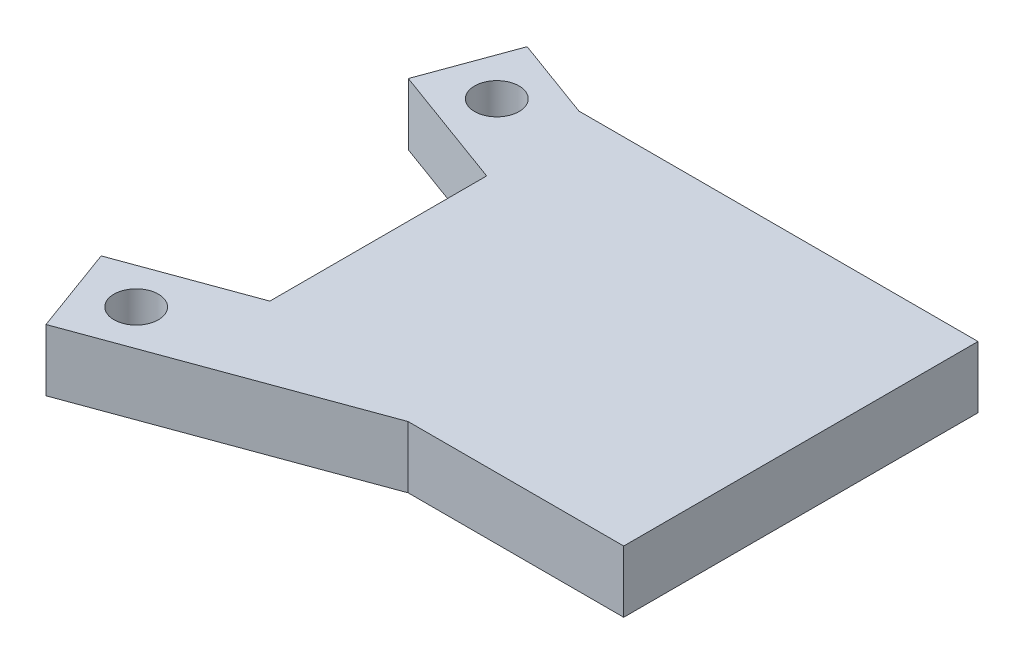
ISO-10303-21;
HEADER;
FILE_DESCRIPTION(('STEP AP214'),'2;1');
FILE_NAME('part.step','',(''),(''),'','','');
FILE_SCHEMA(('AUTOMOTIVE_DESIGN { 1 0 10303 214 1 1 1 1 }'));
ENDSEC;
DATA;
#1=APPLICATION_CONTEXT('core data for automotive mechanical design processes');
#2=APPLICATION_PROTOCOL_DEFINITION('international standard','automotive_design',2000,#1);
#3=PRODUCT_CONTEXT('',#1,'mechanical');
#4=PRODUCT('Part','Part','',(#3));
#5=PRODUCT_RELATED_PRODUCT_CATEGORY('part','',(#4));
#6=PRODUCT_DEFINITION_FORMATION('','',#4);
#7=PRODUCT_DEFINITION_CONTEXT('part definition',#1,'design');
#8=PRODUCT_DEFINITION('design','',#6,#7);
#9=PRODUCT_DEFINITION_SHAPE('','',#8);
#10=(LENGTH_UNIT() NAMED_UNIT(*) SI_UNIT(.MILLI.,.METRE.));
#11=(NAMED_UNIT(*) PLANE_ANGLE_UNIT() SI_UNIT($,.RADIAN.));
#12=(NAMED_UNIT(*) SI_UNIT($,.STERADIAN.) SOLID_ANGLE_UNIT());
#13=UNCERTAINTY_MEASURE_WITH_UNIT(LENGTH_MEASURE(1.E-05),#10,'distance_accuracy_value','');
#14=(GEOMETRIC_REPRESENTATION_CONTEXT(3) GLOBAL_UNCERTAINTY_ASSIGNED_CONTEXT((#13)) GLOBAL_UNIT_ASSIGNED_CONTEXT((#10,
#11,#12)) REPRESENTATION_CONTEXT('',''));
#15=CARTESIAN_POINT('',(0.,0.,0.));
#16=DIRECTION('',(0.,0.,1.));
#17=DIRECTION('',(1.,0.,0.));
#18=AXIS2_PLACEMENT_3D('',#15,#16,#17);
#19=CARTESIAN_POINT('',(17.9561225197457,6.35,30.7695046606628));
#20=DIRECTION('',(0.939099535747027,0.,0.34364525598314));
#21=DIRECTION('',(0.34364525598314,0.,-0.939099535747028));
#22=AXIS2_PLACEMENT_3D('',#19,#20,#21);
#23=PLANE('',#22);
#24=DIRECTION('',(-0.34364525598314,0.,0.939099535747027));
#25=VECTOR('',#24,1.);
#26=CARTESIAN_POINT('',(17.9561225197457,0.,30.7695046606628));
#27=LINE('',#26,#25);
#28=CARTESIAN_POINT('',(21.2293435829851,0.,21.8245815826724));
#29=VERTEX_POINT('',#28);
#30=CARTESIAN_POINT('',(17.9561225197457,0.,30.7695046606628));
#31=VERTEX_POINT('',#30);
#32=EDGE_CURVE('E147',#29,#31,#27,.T.);
#33=ORIENTED_EDGE('',*,*,#32,.T.);
#34=DIRECTION('',(0.,-1.,0.));
#35=VECTOR('',#34,1.);
#36=CARTESIAN_POINT('',(17.9561225197457,6.35,30.7695046606628));
#37=LINE('',#36,#35);
#38=CARTESIAN_POINT('',(17.9561225197457,6.35,30.7695046606628));
#39=VERTEX_POINT('',#38);
#40=EDGE_CURVE('E11',#39,#31,#37,.T.);
#41=ORIENTED_EDGE('',*,*,#40,.F.);
#42=DIRECTION('',(-0.34364525598314,0.,0.939099535747027));
#43=VECTOR('',#42,1.);
#44=CARTESIAN_POINT('',(17.9561225197457,6.35,30.7695046606628));
#45=LINE('',#44,#43);
#46=CARTESIAN_POINT('',(21.2293435829851,6.35,21.8245815826724));
#47=VERTEX_POINT('',#46);
#48=EDGE_CURVE('E166',#47,#39,#45,.T.);
#49=ORIENTED_EDGE('',*,*,#48,.F.);
#50=DIRECTION('',(0.,-1.,0.));
#51=VECTOR('',#50,1.);
#52=CARTESIAN_POINT('',(21.2293435829851,6.35,21.8245815826724));
#53=LINE('',#52,#51);
#54=EDGE_CURVE('E143',#47,#29,#53,.T.);
#55=ORIENTED_EDGE('',*,*,#54,.T.);
#56=EDGE_LOOP('',(#33,#41,#49,#55));
#57=FACE_BOUND('',#56,.T.);
#58=ADVANCED_FACE('F39',(#57),#23,.F.);
#59=CARTESIAN_POINT('',(30.6561225197457,6.35,35.4168232726502));
#60=DIRECTION('',(0.343645255983139,0.,-0.939099535747028));
#61=DIRECTION('',(-0.939099535747028,0.,-0.343645255983139));
#62=AXIS2_PLACEMENT_3D('',#59,#60,#61);
#63=PLANE('',#62);
#64=DIRECTION('',(0.939099535747028,0.,0.343645255983139));
#65=VECTOR('',#64,1.);
#66=CARTESIAN_POINT('',(30.6561225197457,0.,35.4168232726502));
#67=LINE('',#66,#65);
#68=CARTESIAN_POINT('',(30.6561225197457,0.,35.4168232726502));
#69=VERTEX_POINT('',#68);
#70=EDGE_CURVE('E150',#31,#69,#67,.T.);
#71=ORIENTED_EDGE('',*,*,#70,.T.);
#72=DIRECTION('',(0.,-1.,0.));
#73=VECTOR('',#72,1.);
#74=CARTESIAN_POINT('',(30.6561225197457,6.35,35.4168232726502));
#75=LINE('',#74,#73);
#76=CARTESIAN_POINT('',(30.6561225197457,6.35,35.4168232726502));
#77=VERTEX_POINT('',#76);
#78=EDGE_CURVE('E47',#77,#69,#75,.T.);
#79=ORIENTED_EDGE('',*,*,#78,.F.);
#80=DIRECTION('',(0.939099535747028,0.,0.343645255983139));
#81=VECTOR('',#80,1.);
#82=CARTESIAN_POINT('',(30.6561225197457,6.35,35.4168232726502));
#83=LINE('',#82,#81);
#84=EDGE_CURVE('E104',#39,#77,#83,.T.);
#85=ORIENTED_EDGE('',*,*,#84,.F.);
#86=ORIENTED_EDGE('',*,*,#40,.T.);
#87=EDGE_LOOP('',(#71,#79,#85,#86));
#88=FACE_BOUND('',#87,.T.);
#89=ADVANCED_FACE('F249',(#88),#63,.F.);
#90=CARTESIAN_POINT('',(30.6561225197457,6.35,57.710487253352));
#91=DIRECTION('',(1.,0.,0.));
#92=DIRECTION('',(0.,0.,-1.));
#93=AXIS2_PLACEMENT_3D('',#90,#91,#92);
#94=PLANE('',#93);
#95=DIRECTION('',(0.,0.,1.));
#96=VECTOR('',#95,1.);
#97=CARTESIAN_POINT('',(30.6561225197457,0.,57.710487253352));
#98=LINE('',#97,#96);
#99=CARTESIAN_POINT('',(30.6561225197457,0.,57.710487253352));
#100=VERTEX_POINT('',#99);
#101=EDGE_CURVE('E153',#69,#100,#98,.T.);
#102=ORIENTED_EDGE('',*,*,#101,.T.);
#103=DIRECTION('',(0.,-1.,0.));
#104=VECTOR('',#103,1.);
#105=CARTESIAN_POINT('',(30.6561225197457,6.35,57.710487253352));
#106=LINE('',#105,#104);
#107=CARTESIAN_POINT('',(30.6561225197457,6.35,57.710487253352));
#108=VERTEX_POINT('',#107);
#109=EDGE_CURVE('E179',#108,#100,#106,.T.);
#110=ORIENTED_EDGE('',*,*,#109,.F.);
#111=DIRECTION('',(0.,0.,1.));
#112=VECTOR('',#111,1.);
#113=CARTESIAN_POINT('',(30.6561225197457,6.35,57.710487253352));
#114=LINE('',#113,#112);
#115=EDGE_CURVE('E187',#77,#108,#114,.T.);
#116=ORIENTED_EDGE('',*,*,#115,.F.);
#117=ORIENTED_EDGE('',*,*,#78,.T.);
#118=EDGE_LOOP('',(#102,#110,#116,#117));
#119=FACE_BOUND('',#118,.T.);
#120=ADVANCED_FACE('F185',(#119),#94,.F.);
#121=CARTESIAN_POINT('',(30.6561225197457,6.35,57.710487253352));
#122=DIRECTION('',(0.34364525598314,0.,0.939099535747027));
#123=DIRECTION('',(0.939099535747027,0.,-0.34364525598314));
#124=AXIS2_PLACEMENT_3D('',#121,#122,#123);
#125=PLANE('',#124);
#126=DIRECTION('',(-0.939099535747027,0.,0.34364525598314));
#127=VECTOR('',#126,1.);
#128=CARTESIAN_POINT('',(30.6561225197457,0.,57.710487253352));
#129=LINE('',#128,#127);
#130=CARTESIAN_POINT('',(17.9561225197457,0.,62.3578058653394));
#131=VERTEX_POINT('',#130);
#132=EDGE_CURVE('E155',#100,#131,#129,.T.);
#133=ORIENTED_EDGE('',*,*,#132,.T.);
#134=DIRECTION('',(0.,-1.,0.));
#135=VECTOR('',#134,1.);
#136=CARTESIAN_POINT('',(17.9561225197457,6.35,62.3578058653394));
#137=LINE('',#136,#135);
#138=CARTESIAN_POINT('',(17.9561225197457,6.35,62.3578058653394));
#139=VERTEX_POINT('',#138);
#140=EDGE_CURVE('E176',#139,#131,#137,.T.);
#141=ORIENTED_EDGE('',*,*,#140,.F.);
#142=DIRECTION('',(-0.939099535747027,0.,0.34364525598314));
#143=VECTOR('',#142,1.);
#144=CARTESIAN_POINT('',(30.6561225197457,6.35,57.710487253352));
#145=LINE('',#144,#143);
#146=EDGE_CURVE('E205',#108,#139,#145,.T.);
#147=ORIENTED_EDGE('',*,*,#146,.F.);
#148=ORIENTED_EDGE('',*,*,#109,.T.);
#149=EDGE_LOOP('',(#133,#141,#147,#148));
#150=FACE_BOUND('',#149,.T.);
#151=ADVANCED_FACE('F196',(#150),#125,.F.);
#152=CARTESIAN_POINT('',(17.9561225197457,6.35,62.3578058653394));
#153=DIRECTION('',(0.939099535747027,0.,-0.343645255983141));
#154=DIRECTION('',(-0.343645255983141,0.,-0.939099535747027));
#155=AXIS2_PLACEMENT_3D('',#152,#153,#154);
#156=PLANE('',#155);
#157=DIRECTION('',(0.343645255983141,0.,0.939099535747027));
#158=VECTOR('',#157,1.);
#159=CARTESIAN_POINT('',(17.9561225197457,0.,62.3578058653394));
#160=LINE('',#159,#158);
#161=CARTESIAN_POINT('',(21.2293435829851,0.,71.3027289433298));
#162=VERTEX_POINT('',#161);
#163=EDGE_CURVE('E157',#131,#162,#160,.T.);
#164=ORIENTED_EDGE('',*,*,#163,.T.);
#165=DIRECTION('',(0.,-1.,0.));
#166=VECTOR('',#165,1.);
#167=CARTESIAN_POINT('',(21.2293435829851,6.35,71.3027289433298));
#168=LINE('',#167,#166);
#169=CARTESIAN_POINT('',(21.2293435829851,6.35,71.3027289433298));
#170=VERTEX_POINT('',#169);
#171=EDGE_CURVE('E173',#170,#162,#168,.T.);
#172=ORIENTED_EDGE('',*,*,#171,.F.);
#173=DIRECTION('',(0.343645255983141,0.,0.939099535747027));
#174=VECTOR('',#173,1.);
#175=CARTESIAN_POINT('',(17.9561225197457,6.35,62.3578058653394));
#176=LINE('',#175,#174);
#177=EDGE_CURVE('E202',#139,#170,#176,.T.);
#178=ORIENTED_EDGE('',*,*,#177,.F.);
#179=ORIENTED_EDGE('',*,*,#140,.T.);
#180=EDGE_LOOP('',(#164,#172,#178,#179));
#181=FACE_BOUND('',#180,.T.);
#182=ADVANCED_FACE('F200',(#181),#156,.F.);
#183=CARTESIAN_POINT('',(21.2293435829851,6.35,71.3027289433298));
#184=DIRECTION('',(-0.34364525598314,0.,-0.939099535747027));
#185=DIRECTION('',(-0.939099535747027,0.,0.34364525598314));
#186=AXIS2_PLACEMENT_3D('',#183,#184,#185);
#187=PLANE('',#186);
#188=DIRECTION('',(0.939099535747027,0.,-0.34364525598314));
#189=VECTOR('',#188,1.);
#190=CARTESIAN_POINT('',(21.2293435829851,0.,71.3027289433298));
#191=LINE('',#190,#189);
#192=CARTESIAN_POINT('',(48.4894953645734,0.,61.327405263001));
#193=VERTEX_POINT('',#192);
#194=EDGE_CURVE('E159',#162,#193,#191,.T.);
#195=ORIENTED_EDGE('',*,*,#194,.T.);
#196=DIRECTION('',(0.,-1.,0.));
#197=VECTOR('',#196,1.);
#198=CARTESIAN_POINT('',(48.4894953645734,6.35,61.327405263001));
#199=LINE('',#198,#197);
#200=CARTESIAN_POINT('',(48.4894953645734,6.35,61.327405263001));
#201=VERTEX_POINT('',#200);
#202=EDGE_CURVE('E170',#201,#193,#199,.T.);
#203=ORIENTED_EDGE('',*,*,#202,.F.);
#204=DIRECTION('',(0.939099535747027,0.,-0.34364525598314));
#205=VECTOR('',#204,1.);
#206=CARTESIAN_POINT('',(21.2293435829851,6.35,71.3027289433298));
#207=LINE('',#206,#205);
#208=EDGE_CURVE('E204',#170,#201,#207,.T.);
#209=ORIENTED_EDGE('',*,*,#208,.F.);
#210=ORIENTED_EDGE('',*,*,#171,.T.);
#211=EDGE_LOOP('',(#195,#203,#209,#210));
#212=FACE_BOUND('',#211,.T.);
#213=ADVANCED_FACE('F261',(#212),#187,.F.);
#214=CARTESIAN_POINT('',(48.4894953645734,6.35,61.327405263001));
#215=DIRECTION('',(0.,0.,-1.));
#216=DIRECTION('',(-1.,0.,0.));
#217=AXIS2_PLACEMENT_3D('',#214,#215,#216);
#218=PLANE('',#217);
#219=DIRECTION('',(1.,0.,0.));
#220=VECTOR('',#219,1.);
#221=CARTESIAN_POINT('',(48.4894953645734,0.,61.327405263001));
#222=LINE('',#221,#220);
#223=CARTESIAN_POINT('',(70.6611225197457,0.,61.327405263001));
#224=VERTEX_POINT('',#223);
#225=EDGE_CURVE('E161',#193,#224,#222,.T.);
#226=ORIENTED_EDGE('',*,*,#225,.T.);
#227=DIRECTION('',(0.,-1.,0.));
#228=VECTOR('',#227,1.);
#229=CARTESIAN_POINT('',(70.6611225197457,6.35,61.327405263001));
#230=LINE('',#229,#228);
#231=CARTESIAN_POINT('',(70.6611225197457,6.35,61.327405263001));
#232=VERTEX_POINT('',#231);
#233=EDGE_CURVE('E138',#232,#224,#230,.T.);
#234=ORIENTED_EDGE('',*,*,#233,.F.);
#235=DIRECTION('',(1.,0.,0.));
#236=VECTOR('',#235,1.);
#237=CARTESIAN_POINT('',(48.4894953645734,6.35,61.327405263001));
#238=LINE('',#237,#236);
#239=EDGE_CURVE('E129',#201,#232,#238,.T.);
#240=ORIENTED_EDGE('',*,*,#239,.F.);
#241=ORIENTED_EDGE('',*,*,#202,.T.);
#242=EDGE_LOOP('',(#226,#234,#240,#241));
#243=FACE_BOUND('',#242,.T.);
#244=ADVANCED_FACE('F258',(#243),#218,.F.);
#245=CARTESIAN_POINT('',(70.6611225197457,6.35,24.8971594656273));
#246=DIRECTION('',(-1.,0.,0.));
#247=DIRECTION('',(0.,0.,1.));
#248=AXIS2_PLACEMENT_3D('',#245,#246,#247);
#249=PLANE('',#248);
#250=DIRECTION('',(0.,0.,-1.));
#251=VECTOR('',#250,1.);
#252=CARTESIAN_POINT('',(70.6611225197457,0.,24.8971594656273));
#253=LINE('',#252,#251);
#254=CARTESIAN_POINT('',(70.6611225197457,0.,24.8971594656273));
#255=VERTEX_POINT('',#254);
#256=EDGE_CURVE('E137',#224,#255,#253,.T.);
#257=ORIENTED_EDGE('',*,*,#256,.T.);
#258=DIRECTION('',(0.,-1.,0.));
#259=VECTOR('',#258,1.);
#260=CARTESIAN_POINT('',(70.6611225197457,6.35,24.8971594656273));
#261=LINE('',#260,#259);
#262=CARTESIAN_POINT('',(70.6611225197457,6.35,24.8971594656273));
#263=VERTEX_POINT('',#262);
#264=EDGE_CURVE('E134',#263,#255,#261,.T.);
#265=ORIENTED_EDGE('',*,*,#264,.F.);
#266=DIRECTION('',(0.,0.,-1.));
#267=VECTOR('',#266,1.);
#268=CARTESIAN_POINT('',(70.6611225197457,6.35,24.8971594656273));
#269=LINE('',#268,#267);
#270=EDGE_CURVE('E123',#232,#263,#269,.T.);
#271=ORIENTED_EDGE('',*,*,#270,.F.);
#272=ORIENTED_EDGE('',*,*,#233,.T.);
#273=EDGE_LOOP('',(#257,#265,#271,#272));
#274=FACE_BOUND('',#273,.T.);
#275=ADVANCED_FACE('F135',(#274),#249,.F.);
#276=CARTESIAN_POINT('',(29.625957280371,6.35,24.8971594656262));
#277=DIRECTION('',(0.,0.,1.));
#278=DIRECTION('',(1.,0.,0.));
#279=AXIS2_PLACEMENT_3D('',#276,#277,#278);
#280=PLANE('',#279);
#281=DIRECTION('',(-1.,0.,0.));
#282=VECTOR('',#281,1.);
#283=CARTESIAN_POINT('',(29.625957280371,0.,24.8971594656262));
#284=LINE('',#283,#282);
#285=CARTESIAN_POINT('',(29.625957280371,0.,24.8971594656262));
#286=VERTEX_POINT('',#285);
#287=EDGE_CURVE('E90',#255,#286,#284,.T.);
#288=ORIENTED_EDGE('',*,*,#287,.T.);
#289=DIRECTION('',(0.,-1.,0.));
#290=VECTOR('',#289,1.);
#291=CARTESIAN_POINT('',(29.625957280371,6.35,24.8971594656262));
#292=LINE('',#291,#290);
#293=CARTESIAN_POINT('',(29.625957280371,6.35,24.8971594656262));
#294=VERTEX_POINT('',#293);
#295=EDGE_CURVE('E139',#294,#286,#292,.T.);
#296=ORIENTED_EDGE('',*,*,#295,.F.);
#297=DIRECTION('',(-1.,0.,0.));
#298=VECTOR('',#297,1.);
#299=CARTESIAN_POINT('',(29.625957280371,6.35,24.8971594656262));
#300=LINE('',#299,#298);
#301=EDGE_CURVE('E127',#263,#294,#300,.T.);
#302=ORIENTED_EDGE('',*,*,#301,.F.);
#303=ORIENTED_EDGE('',*,*,#264,.T.);
#304=EDGE_LOOP('',(#288,#296,#302,#303));
#305=FACE_BOUND('',#304,.T.);
#306=ADVANCED_FACE('F141',(#305),#280,.F.);
#307=CARTESIAN_POINT('',(21.2293435829851,6.35,21.8245815826724));
#308=DIRECTION('',(-0.343645255983018,0.,0.939099535747072));
#309=DIRECTION('',(0.939099535747072,0.,0.343645255983018));
#310=AXIS2_PLACEMENT_3D('',#307,#308,#309);
#311=PLANE('',#310);
#312=DIRECTION('',(-0.939099535747072,0.,-0.343645255983018));
#313=VECTOR('',#312,1.);
#314=CARTESIAN_POINT('',(21.2293435829851,0.,21.8245815826724));
#315=LINE('',#314,#313);
#316=EDGE_CURVE('E96',#286,#29,#315,.T.);
#317=ORIENTED_EDGE('',*,*,#316,.T.);
#318=ORIENTED_EDGE('',*,*,#54,.F.);
#319=DIRECTION('',(-0.939099535747072,0.,-0.343645255983018));
#320=VECTOR('',#319,1.);
#321=CARTESIAN_POINT('',(21.2293435829851,6.35,21.8245815826724));
#322=LINE('',#321,#320);
#323=EDGE_CURVE('E55',#294,#47,#322,.T.);
#324=ORIENTED_EDGE('',*,*,#323,.F.);
#325=ORIENTED_EDGE('',*,*,#295,.T.);
#326=EDGE_LOOP('',(#317,#318,#324,#325));
#327=FACE_BOUND('',#326,.T.);
#328=ADVANCED_FACE('F236',(#327),#311,.F.);
#329=CARTESIAN_POINT('',(0.,6.35,0.));
#330=DIRECTION('',(0.,-1.,0.));
#331=DIRECTION('',(0.,0.,-1.));
#332=AXIS2_PLACEMENT_3D('',#329,#330,#331);
#333=PLANE('',#332);
#334=CARTESIAN_POINT('',(24.3061225197479,6.35,65.1054939711098));
#335=DIRECTION('',(0.,1.,0.));
#336=DIRECTION('',(0.,0.,1.));
#337=AXIS2_PLACEMENT_3D('',#334,#335,#336);
#338=CIRCLE('',#337,2.286);
#339=CARTESIAN_POINT('',(24.3061225197479,6.35,67.3914939711098));
#340=VERTEX_POINT('',#339);
#341=EDGE_CURVE('E219',#340,#340,#338,.T.);
#342=ORIENTED_EDGE('',*,*,#341,.F.);
#343=EDGE_LOOP('',(#342));
#344=FACE_BOUND('',#343,.T.);
#345=CARTESIAN_POINT('',(24.3061225197479,6.35,28.0218165548916));
#346=DIRECTION('',(0.,1.,0.));
#347=DIRECTION('',(0.,0.,1.));
#348=AXIS2_PLACEMENT_3D('',#345,#346,#347);
#349=CIRCLE('',#348,2.28600000000006);
#350=CARTESIAN_POINT('',(24.3061225197479,6.35,30.3078165548917));
#351=VERTEX_POINT('',#350);
#352=EDGE_CURVE('E216',#351,#351,#349,.T.);
#353=ORIENTED_EDGE('',*,*,#352,.F.);
#354=EDGE_LOOP('',(#353));
#355=FACE_BOUND('',#354,.T.);
#356=ORIENTED_EDGE('',*,*,#48,.T.);
#357=ORIENTED_EDGE('',*,*,#84,.T.);
#358=ORIENTED_EDGE('',*,*,#115,.T.);
#359=ORIENTED_EDGE('',*,*,#146,.T.);
#360=ORIENTED_EDGE('',*,*,#177,.T.);
#361=ORIENTED_EDGE('',*,*,#208,.T.);
#362=ORIENTED_EDGE('',*,*,#239,.T.);
#363=ORIENTED_EDGE('',*,*,#270,.T.);
#364=ORIENTED_EDGE('',*,*,#301,.T.);
#365=ORIENTED_EDGE('',*,*,#323,.T.);
#366=EDGE_LOOP('',(#356,#357,#358,#359,#360,#361,#362,#363,#364,#365));
#367=FACE_BOUND('',#366,.T.);
#368=ADVANCED_FACE('F125',(#344,#355,#367),#333,.F.);
#369=CARTESIAN_POINT('',(0.,0.,0.));
#370=DIRECTION('',(0.,-1.,0.));
#371=DIRECTION('',(0.,0.,-1.));
#372=AXIS2_PLACEMENT_3D('',#369,#370,#371);
#373=PLANE('',#372);
#374=CARTESIAN_POINT('',(24.3061225197479,0.,65.1054939711098));
#375=DIRECTION('',(0.,1.,0.));
#376=DIRECTION('',(0.,0.,1.));
#377=AXIS2_PLACEMENT_3D('',#374,#375,#376);
#378=CIRCLE('',#377,2.286);
#379=CARTESIAN_POINT('',(24.3061225197479,0.,67.3914939711098));
#380=VERTEX_POINT('',#379);
#381=EDGE_CURVE('E151',#380,#380,#378,.T.);
#382=ORIENTED_EDGE('',*,*,#381,.T.);
#383=EDGE_LOOP('',(#382));
#384=FACE_BOUND('',#383,.T.);
#385=CARTESIAN_POINT('',(24.3061225197479,0.,28.0218165548916));
#386=DIRECTION('',(0.,1.,0.));
#387=DIRECTION('',(0.,0.,1.));
#388=AXIS2_PLACEMENT_3D('',#385,#386,#387);
#389=CIRCLE('',#388,2.28600000000006);
#390=CARTESIAN_POINT('',(24.3061225197479,0.,30.3078165548917));
#391=VERTEX_POINT('',#390);
#392=EDGE_CURVE('E213',#391,#391,#389,.T.);
#393=ORIENTED_EDGE('',*,*,#392,.T.);
#394=EDGE_LOOP('',(#393));
#395=FACE_BOUND('',#394,.T.);
#396=ORIENTED_EDGE('',*,*,#32,.F.);
#397=ORIENTED_EDGE('',*,*,#316,.F.);
#398=ORIENTED_EDGE('',*,*,#287,.F.);
#399=ORIENTED_EDGE('',*,*,#256,.F.);
#400=ORIENTED_EDGE('',*,*,#225,.F.);
#401=ORIENTED_EDGE('',*,*,#194,.F.);
#402=ORIENTED_EDGE('',*,*,#163,.F.);
#403=ORIENTED_EDGE('',*,*,#132,.F.);
#404=ORIENTED_EDGE('',*,*,#101,.F.);
#405=ORIENTED_EDGE('',*,*,#70,.F.);
#406=EDGE_LOOP('',(#396,#397,#398,#399,#400,#401,#402,#403,#404,#405));
#407=FACE_BOUND('',#406,.T.);
#408=ADVANCED_FACE('F191',(#384,#395,#407),#373,.T.);
#409=CARTESIAN_POINT('',(24.3061225197479,0.,28.0218165548916));
#410=DIRECTION('',(0.,1.,0.));
#411=DIRECTION('',(0.,0.,1.));
#412=AXIS2_PLACEMENT_3D('',#409,#410,#411);
#413=CYLINDRICAL_SURFACE('',#412,2.28600000000006);
#414=ORIENTED_EDGE('',*,*,#392,.F.);
#415=EDGE_LOOP('',(#414));
#416=FACE_BOUND('',#415,.T.);
#417=ORIENTED_EDGE('',*,*,#352,.T.);
#418=EDGE_LOOP('',(#417));
#419=FACE_BOUND('',#418,.T.);
#420=ADVANCED_FACE('F230',(#416,#419),#413,.F.);
#421=CARTESIAN_POINT('',(24.3061225197479,0.,65.1054939711098));
#422=DIRECTION('',(0.,1.,0.));
#423=DIRECTION('',(0.,0.,1.));
#424=AXIS2_PLACEMENT_3D('',#421,#422,#423);
#425=CYLINDRICAL_SURFACE('',#424,2.286);
#426=ORIENTED_EDGE('',*,*,#381,.F.);
#427=EDGE_LOOP('',(#426));
#428=FACE_BOUND('',#427,.T.);
#429=ORIENTED_EDGE('',*,*,#341,.T.);
#430=EDGE_LOOP('',(#429));
#431=FACE_BOUND('',#430,.T.);
#432=ADVANCED_FACE('F227',(#428,#431),#425,.F.);
#433=CLOSED_SHELL('',(#58,#89,#120,#151,#182,#213,#244,#275,#306,#328,#368,#408,#420,#432));
#434=MANIFOLD_SOLID_BREP('B2',#433);
#435=ADVANCED_BREP_SHAPE_REPRESENTATION('',(#18,#434),#14);
#436=SHAPE_DEFINITION_REPRESENTATION(#9,#435);
ENDSEC;
END-ISO-10303-21;
